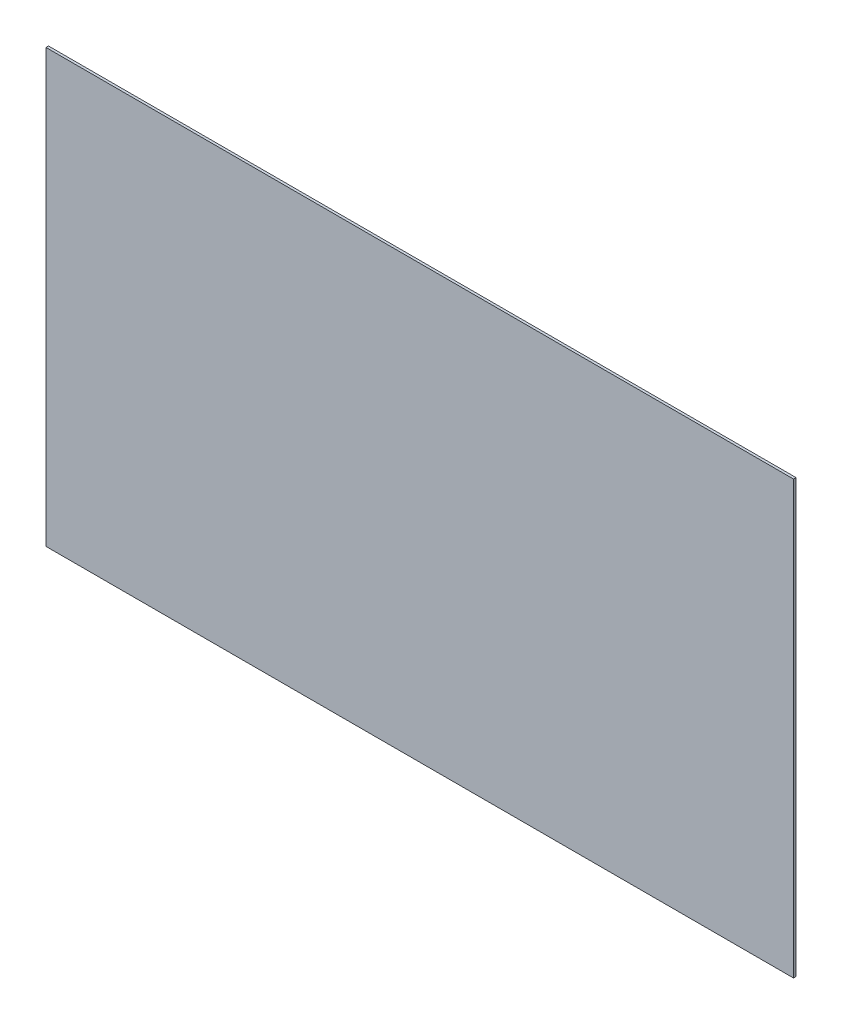
ISO-10303-21;
HEADER;
FILE_DESCRIPTION(('STEP AP214'),'2;1');
FILE_NAME('part.step','',(''),(''),'','','');
FILE_SCHEMA(('AUTOMOTIVE_DESIGN { 1 0 10303 214 1 1 1 1 }'));
ENDSEC;
DATA;
#1=APPLICATION_CONTEXT('core data for automotive mechanical design processes');
#2=APPLICATION_PROTOCOL_DEFINITION('international standard','automotive_design',2000,#1);
#3=PRODUCT_CONTEXT('',#1,'mechanical');
#4=PRODUCT('Part','Part','',(#3));
#5=PRODUCT_RELATED_PRODUCT_CATEGORY('part','',(#4));
#6=PRODUCT_DEFINITION_FORMATION('','',#4);
#7=PRODUCT_DEFINITION_CONTEXT('part definition',#1,'design');
#8=PRODUCT_DEFINITION('design','',#6,#7);
#9=PRODUCT_DEFINITION_SHAPE('','',#8);
#10=(LENGTH_UNIT() NAMED_UNIT(*) SI_UNIT(.MILLI.,.METRE.));
#11=(NAMED_UNIT(*) PLANE_ANGLE_UNIT() SI_UNIT($,.RADIAN.));
#12=(NAMED_UNIT(*) SI_UNIT($,.STERADIAN.) SOLID_ANGLE_UNIT());
#13=UNCERTAINTY_MEASURE_WITH_UNIT(LENGTH_MEASURE(1.E-05),#10,'distance_accuracy_value','');
#14=(GEOMETRIC_REPRESENTATION_CONTEXT(3) GLOBAL_UNCERTAINTY_ASSIGNED_CONTEXT((#13)) GLOBAL_UNIT_ASSIGNED_CONTEXT((#10,
#11,#12)) REPRESENTATION_CONTEXT('',''));
#15=CARTESIAN_POINT('',(0.,0.,0.));
#16=DIRECTION('',(0.,0.,1.));
#17=DIRECTION('',(1.,0.,0.));
#18=AXIS2_PLACEMENT_3D('',#15,#16,#17);
#19=CARTESIAN_POINT('',(148.49,-85.85,1.));
#20=DIRECTION('',(-1.,0.,0.));
#21=DIRECTION('',(0.,0.,1.));
#22=AXIS2_PLACEMENT_3D('',#19,#20,#21);
#23=PLANE('',#22);
#24=DIRECTION('',(0.,1.,0.));
#25=VECTOR('',#24,1.);
#26=CARTESIAN_POINT('',(148.49,-85.85,0.));
#27=LINE('',#26,#25);
#28=CARTESIAN_POINT('',(148.49,-85.85,0.));
#29=VERTEX_POINT('',#28);
#30=CARTESIAN_POINT('',(148.49,85.85,0.));
#31=VERTEX_POINT('',#30);
#32=EDGE_CURVE('E115',#29,#31,#27,.T.);
#33=ORIENTED_EDGE('',*,*,#32,.T.);
#34=DIRECTION('',(0.,0.,-1.));
#35=VECTOR('',#34,1.);
#36=CARTESIAN_POINT('',(148.49,85.85,1.));
#37=LINE('',#36,#35);
#38=CARTESIAN_POINT('',(148.49,85.85,1.));
#39=VERTEX_POINT('',#38);
#40=EDGE_CURVE('E11',#39,#31,#37,.T.);
#41=ORIENTED_EDGE('',*,*,#40,.F.);
#42=DIRECTION('',(0.,1.,0.));
#43=VECTOR('',#42,1.);
#44=CARTESIAN_POINT('',(148.49,-85.85,1.));
#45=LINE('',#44,#43);
#46=CARTESIAN_POINT('',(148.49,-85.85,1.));
#47=VERTEX_POINT('',#46);
#48=EDGE_CURVE('E99',#47,#39,#45,.T.);
#49=ORIENTED_EDGE('',*,*,#48,.F.);
#50=DIRECTION('',(0.,0.,-1.));
#51=VECTOR('',#50,1.);
#52=CARTESIAN_POINT('',(148.49,-85.85,1.));
#53=LINE('',#52,#51);
#54=EDGE_CURVE('E111',#47,#29,#53,.T.);
#55=ORIENTED_EDGE('',*,*,#54,.T.);
#56=EDGE_LOOP('',(#33,#41,#49,#55));
#57=FACE_BOUND('',#56,.T.);
#58=ADVANCED_FACE('F47',(#57),#23,.F.);
#59=CARTESIAN_POINT('',(-148.49,85.85,1.));
#60=DIRECTION('',(0.,-1.,0.));
#61=DIRECTION('',(0.,0.,-1.));
#62=AXIS2_PLACEMENT_3D('',#59,#60,#61);
#63=PLANE('',#62);
#64=DIRECTION('',(-1.,0.,0.));
#65=VECTOR('',#64,1.);
#66=CARTESIAN_POINT('',(-148.49,85.85,0.));
#67=LINE('',#66,#65);
#68=CARTESIAN_POINT('',(-148.49,85.85,0.));
#69=VERTEX_POINT('',#68);
#70=EDGE_CURVE('E104',#31,#69,#67,.T.);
#71=ORIENTED_EDGE('',*,*,#70,.T.);
#72=DIRECTION('',(0.,0.,-1.));
#73=VECTOR('',#72,1.);
#74=CARTESIAN_POINT('',(-148.49,85.85,1.));
#75=LINE('',#74,#73);
#76=CARTESIAN_POINT('',(-148.49,85.85,1.));
#77=VERTEX_POINT('',#76);
#78=EDGE_CURVE('E56',#77,#69,#75,.T.);
#79=ORIENTED_EDGE('',*,*,#78,.F.);
#80=DIRECTION('',(-1.,0.,0.));
#81=VECTOR('',#80,1.);
#82=CARTESIAN_POINT('',(-148.49,85.85,1.));
#83=LINE('',#82,#81);
#84=EDGE_CURVE('E94',#39,#77,#83,.T.);
#85=ORIENTED_EDGE('',*,*,#84,.F.);
#86=ORIENTED_EDGE('',*,*,#40,.T.);
#87=EDGE_LOOP('',(#71,#79,#85,#86));
#88=FACE_BOUND('',#87,.T.);
#89=ADVANCED_FACE('F103',(#88),#63,.F.);
#90=CARTESIAN_POINT('',(-148.49,-85.85,1.));
#91=DIRECTION('',(1.,0.,0.));
#92=DIRECTION('',(0.,0.,-1.));
#93=AXIS2_PLACEMENT_3D('',#90,#91,#92);
#94=PLANE('',#93);
#95=DIRECTION('',(0.,-1.,0.));
#96=VECTOR('',#95,1.);
#97=CARTESIAN_POINT('',(-148.49,-85.85,0.));
#98=LINE('',#97,#96);
#99=CARTESIAN_POINT('',(-148.49,-85.85,0.));
#100=VERTEX_POINT('',#99);
#101=EDGE_CURVE('E81',#69,#100,#98,.T.);
#102=ORIENTED_EDGE('',*,*,#101,.T.);
#103=DIRECTION('',(0.,0.,-1.));
#104=VECTOR('',#103,1.);
#105=CARTESIAN_POINT('',(-148.49,-85.85,1.));
#106=LINE('',#105,#104);
#107=CARTESIAN_POINT('',(-148.49,-85.85,1.));
#108=VERTEX_POINT('',#107);
#109=EDGE_CURVE('E106',#108,#100,#106,.T.);
#110=ORIENTED_EDGE('',*,*,#109,.F.);
#111=DIRECTION('',(0.,-1.,0.));
#112=VECTOR('',#111,1.);
#113=CARTESIAN_POINT('',(-148.49,-85.85,1.));
#114=LINE('',#113,#112);
#115=EDGE_CURVE('E97',#77,#108,#114,.T.);
#116=ORIENTED_EDGE('',*,*,#115,.F.);
#117=ORIENTED_EDGE('',*,*,#78,.T.);
#118=EDGE_LOOP('',(#102,#110,#116,#117));
#119=FACE_BOUND('',#118,.T.);
#120=ADVANCED_FACE('F107',(#119),#94,.F.);
#121=CARTESIAN_POINT('',(-148.49,-85.85,1.));
#122=DIRECTION('',(0.,1.,0.));
#123=DIRECTION('',(0.,0.,1.));
#124=AXIS2_PLACEMENT_3D('',#121,#122,#123);
#125=PLANE('',#124);
#126=DIRECTION('',(1.,0.,0.));
#127=VECTOR('',#126,1.);
#128=CARTESIAN_POINT('',(-148.49,-85.85,0.));
#129=LINE('',#128,#127);
#130=EDGE_CURVE('E87',#100,#29,#129,.T.);
#131=ORIENTED_EDGE('',*,*,#130,.T.);
#132=ORIENTED_EDGE('',*,*,#54,.F.);
#133=DIRECTION('',(1.,0.,0.));
#134=VECTOR('',#133,1.);
#135=CARTESIAN_POINT('',(-148.49,-85.85,1.));
#136=LINE('',#135,#134);
#137=EDGE_CURVE('E64',#108,#47,#136,.T.);
#138=ORIENTED_EDGE('',*,*,#137,.F.);
#139=ORIENTED_EDGE('',*,*,#109,.T.);
#140=EDGE_LOOP('',(#131,#132,#138,#139));
#141=FACE_BOUND('',#140,.T.);
#142=ADVANCED_FACE('F128',(#141),#125,.F.);
#143=CARTESIAN_POINT('',(0.,0.,1.));
#144=DIRECTION('',(0.,0.,-1.));
#145=DIRECTION('',(-1.,0.,0.));
#146=AXIS2_PLACEMENT_3D('',#143,#144,#145);
#147=PLANE('',#146);
#148=ORIENTED_EDGE('',*,*,#48,.T.);
#149=ORIENTED_EDGE('',*,*,#84,.T.);
#150=ORIENTED_EDGE('',*,*,#115,.T.);
#151=ORIENTED_EDGE('',*,*,#137,.T.);
#152=EDGE_LOOP('',(#148,#149,#150,#151));
#153=FACE_BOUND('',#152,.T.);
#154=ADVANCED_FACE('F95',(#153),#147,.F.);
#155=CARTESIAN_POINT('',(0.,0.,0.));
#156=DIRECTION('',(0.,0.,-1.));
#157=DIRECTION('',(-1.,0.,0.));
#158=AXIS2_PLACEMENT_3D('',#155,#156,#157);
#159=PLANE('',#158);
#160=ORIENTED_EDGE('',*,*,#32,.F.);
#161=ORIENTED_EDGE('',*,*,#130,.F.);
#162=ORIENTED_EDGE('',*,*,#101,.F.);
#163=ORIENTED_EDGE('',*,*,#70,.F.);
#164=EDGE_LOOP('',(#160,#161,#162,#163));
#165=FACE_BOUND('',#164,.T.);
#166=ADVANCED_FACE('F131',(#165),#159,.T.);
#167=CLOSED_SHELL('',(#58,#89,#120,#142,#154,#166));
#168=MANIFOLD_SOLID_BREP('B2',#167);
#169=ADVANCED_BREP_SHAPE_REPRESENTATION('',(#18,#168),#14);
#170=SHAPE_DEFINITION_REPRESENTATION(#9,#169);
ENDSEC;
END-ISO-10303-21;
